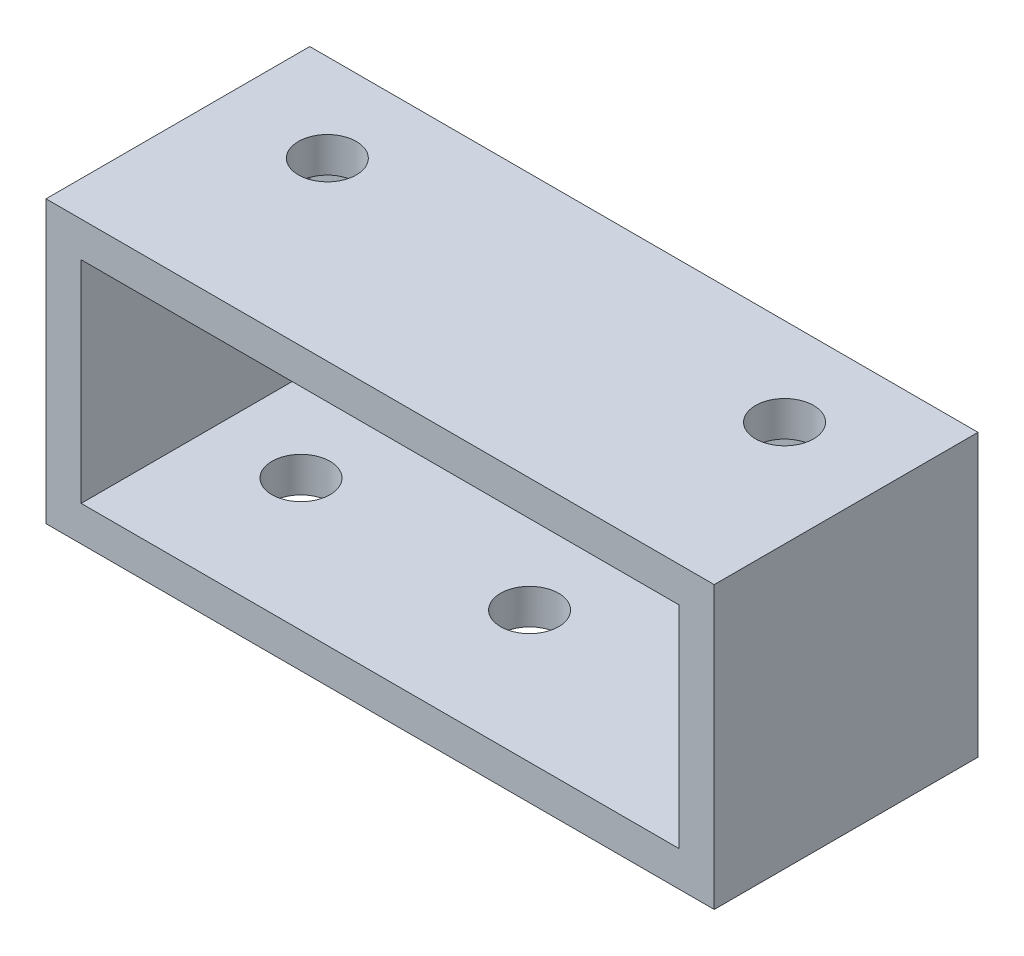
ISO-10303-21;
HEADER;
FILE_DESCRIPTION(('STEP AP214'),'2;1');
FILE_NAME('part.step','',(''),(''),'','','');
FILE_SCHEMA(('AUTOMOTIVE_DESIGN { 1 0 10303 214 1 1 1 1 }'));
ENDSEC;
DATA;
#1=APPLICATION_CONTEXT('core data for automotive mechanical design processes');
#2=APPLICATION_PROTOCOL_DEFINITION('international standard','automotive_design',2000,#1);
#3=PRODUCT_CONTEXT('',#1,'mechanical');
#4=PRODUCT('Part','Part','',(#3));
#5=PRODUCT_RELATED_PRODUCT_CATEGORY('part','',(#4));
#6=PRODUCT_DEFINITION_FORMATION('','',#4);
#7=PRODUCT_DEFINITION_CONTEXT('part definition',#1,'design');
#8=PRODUCT_DEFINITION('design','',#6,#7);
#9=PRODUCT_DEFINITION_SHAPE('','',#8);
#10=(LENGTH_UNIT() NAMED_UNIT(*) SI_UNIT(.MILLI.,.METRE.));
#11=(NAMED_UNIT(*) PLANE_ANGLE_UNIT() SI_UNIT($,.RADIAN.));
#12=(NAMED_UNIT(*) SI_UNIT($,.STERADIAN.) SOLID_ANGLE_UNIT());
#13=UNCERTAINTY_MEASURE_WITH_UNIT(LENGTH_MEASURE(1.E-05),#10,'distance_accuracy_value','');
#14=(GEOMETRIC_REPRESENTATION_CONTEXT(3) GLOBAL_UNCERTAINTY_ASSIGNED_CONTEXT((#13)) GLOBAL_UNIT_ASSIGNED_CONTEXT((#10,
#11,#12)) REPRESENTATION_CONTEXT('',''));
#15=CARTESIAN_POINT('',(0.,0.,0.));
#16=DIRECTION('',(0.,0.,1.));
#17=DIRECTION('',(1.,0.,0.));
#18=AXIS2_PLACEMENT_3D('',#15,#16,#17);
#19=CARTESIAN_POINT('',(0.,16.,0.));
#20=DIRECTION('',(1.,0.,0.));
#21=DIRECTION('',(0.,0.,-1.));
#22=AXIS2_PLACEMENT_3D('',#19,#20,#21);
#23=PLANE('',#22);
#24=DIRECTION('',(0.,0.,1.));
#25=VECTOR('',#24,1.);
#26=CARTESIAN_POINT('',(0.,0.,0.));
#27=LINE('',#26,#25);
#28=CARTESIAN_POINT('',(0.,0.,-15.));
#29=VERTEX_POINT('',#28);
#30=CARTESIAN_POINT('',(0.,0.,0.));
#31=VERTEX_POINT('',#30);
#32=EDGE_CURVE('E145',#29,#31,#27,.T.);
#33=ORIENTED_EDGE('',*,*,#32,.T.);
#34=DIRECTION('',(0.,-1.,0.));
#35=VECTOR('',#34,1.);
#36=CARTESIAN_POINT('',(0.,16.,0.));
#37=LINE('',#36,#35);
#38=CARTESIAN_POINT('',(0.,16.,0.));
#39=VERTEX_POINT('',#38);
#40=EDGE_CURVE('E12',#39,#31,#37,.T.);
#41=ORIENTED_EDGE('',*,*,#40,.F.);
#42=DIRECTION('',(0.,0.,1.));
#43=VECTOR('',#42,1.);
#44=CARTESIAN_POINT('',(0.,16.,0.));
#45=LINE('',#44,#43);
#46=CARTESIAN_POINT('',(0.,16.,-15.));
#47=VERTEX_POINT('',#46);
#48=EDGE_CURVE('E147',#47,#39,#45,.T.);
#49=ORIENTED_EDGE('',*,*,#48,.F.);
#50=DIRECTION('',(0.,-1.,0.));
#51=VECTOR('',#50,1.);
#52=CARTESIAN_POINT('',(0.,16.,-15.));
#53=LINE('',#52,#51);
#54=EDGE_CURVE('E153',#47,#29,#53,.T.);
#55=ORIENTED_EDGE('',*,*,#54,.T.);
#56=EDGE_LOOP('',(#33,#41,#49,#55));
#57=FACE_BOUND('',#56,.T.);
#58=ADVANCED_FACE('F39',(#57),#23,.F.);
#59=CARTESIAN_POINT('',(0.,16.,0.));
#60=DIRECTION('',(0.,0.,-1.));
#61=DIRECTION('',(-1.,0.,0.));
#62=AXIS2_PLACEMENT_3D('',#59,#60,#61);
#63=PLANE('',#62);
#64=DIRECTION('',(1.,0.,0.));
#65=VECTOR('',#64,1.);
#66=CARTESIAN_POINT('',(2.,2.,0.));
#67=LINE('',#66,#65);
#68=CARTESIAN_POINT('',(2.,2.,0.));
#69=VERTEX_POINT('',#68);
#70=CARTESIAN_POINT('',(36.,2.,0.));
#71=VERTEX_POINT('',#70);
#72=EDGE_CURVE('E128',#69,#71,#67,.T.);
#73=ORIENTED_EDGE('',*,*,#72,.F.);
#74=DIRECTION('',(0.,-1.,0.));
#75=VECTOR('',#74,1.);
#76=CARTESIAN_POINT('',(2.,14.,0.));
#77=LINE('',#76,#75);
#78=CARTESIAN_POINT('',(2.,14.,0.));
#79=VERTEX_POINT('',#78);
#80=EDGE_CURVE('E53',#79,#69,#77,.T.);
#81=ORIENTED_EDGE('',*,*,#80,.F.);
#82=DIRECTION('',(-1.,0.,0.));
#83=VECTOR('',#82,1.);
#84=CARTESIAN_POINT('',(36.,14.,0.));
#85=LINE('',#84,#83);
#86=CARTESIAN_POINT('',(36.,14.,0.));
#87=VERTEX_POINT('',#86);
#88=EDGE_CURVE('E134',#87,#79,#85,.T.);
#89=ORIENTED_EDGE('',*,*,#88,.F.);
#90=DIRECTION('',(0.,1.,0.));
#91=VECTOR('',#90,1.);
#92=CARTESIAN_POINT('',(36.,2.,0.));
#93=LINE('',#92,#91);
#94=EDGE_CURVE('E118',#71,#87,#93,.T.);
#95=ORIENTED_EDGE('',*,*,#94,.F.);
#96=EDGE_LOOP('',(#73,#81,#89,#95));
#97=FACE_BOUND('',#96,.T.);
#98=DIRECTION('',(1.,0.,0.));
#99=VECTOR('',#98,1.);
#100=CARTESIAN_POINT('',(0.,0.,0.));
#101=LINE('',#100,#99);
#102=CARTESIAN_POINT('',(38.,0.,0.));
#103=VERTEX_POINT('',#102);
#104=EDGE_CURVE('E156',#31,#103,#101,.T.);
#105=ORIENTED_EDGE('',*,*,#104,.T.);
#106=DIRECTION('',(0.,-1.,0.));
#107=VECTOR('',#106,1.);
#108=CARTESIAN_POINT('',(38.,16.,0.));
#109=LINE('',#108,#107);
#110=CARTESIAN_POINT('',(38.,16.,0.));
#111=VERTEX_POINT('',#110);
#112=EDGE_CURVE('E46',#111,#103,#109,.T.);
#113=ORIENTED_EDGE('',*,*,#112,.F.);
#114=DIRECTION('',(1.,0.,0.));
#115=VECTOR('',#114,1.);
#116=CARTESIAN_POINT('',(0.,16.,0.));
#117=LINE('',#116,#115);
#118=EDGE_CURVE('E90',#39,#111,#117,.T.);
#119=ORIENTED_EDGE('',*,*,#118,.F.);
#120=ORIENTED_EDGE('',*,*,#40,.T.);
#121=EDGE_LOOP('',(#105,#113,#119,#120));
#122=FACE_BOUND('',#121,.T.);
#123=ADVANCED_FACE('F132',(#97,#122),#63,.F.);
#124=CARTESIAN_POINT('',(38.,16.,0.));
#125=DIRECTION('',(-1.,0.,0.));
#126=DIRECTION('',(0.,0.,1.));
#127=AXIS2_PLACEMENT_3D('',#124,#125,#126);
#128=PLANE('',#127);
#129=DIRECTION('',(0.,0.,-1.));
#130=VECTOR('',#129,1.);
#131=CARTESIAN_POINT('',(38.,0.,0.));
#132=LINE('',#131,#130);
#133=CARTESIAN_POINT('',(38.,0.,-15.));
#134=VERTEX_POINT('',#133);
#135=EDGE_CURVE('E158',#103,#134,#132,.T.);
#136=ORIENTED_EDGE('',*,*,#135,.T.);
#137=DIRECTION('',(0.,-1.,0.));
#138=VECTOR('',#137,1.);
#139=CARTESIAN_POINT('',(38.,16.,-15.));
#140=LINE('',#139,#138);
#141=CARTESIAN_POINT('',(38.,16.,-15.));
#142=VERTEX_POINT('',#141);
#143=EDGE_CURVE('E162',#142,#134,#140,.T.);
#144=ORIENTED_EDGE('',*,*,#143,.F.);
#145=DIRECTION('',(0.,0.,-1.));
#146=VECTOR('',#145,1.);
#147=CARTESIAN_POINT('',(38.,16.,0.));
#148=LINE('',#147,#146);
#149=EDGE_CURVE('E150',#111,#142,#148,.T.);
#150=ORIENTED_EDGE('',*,*,#149,.F.);
#151=ORIENTED_EDGE('',*,*,#112,.T.);
#152=EDGE_LOOP('',(#136,#144,#150,#151));
#153=FACE_BOUND('',#152,.T.);
#154=ADVANCED_FACE('F167',(#153),#128,.F.);
#155=CARTESIAN_POINT('',(0.,16.,-15.));
#156=DIRECTION('',(0.,0.,1.));
#157=DIRECTION('',(1.,0.,0.));
#158=AXIS2_PLACEMENT_3D('',#155,#156,#157);
#159=PLANE('',#158);
#160=DIRECTION('',(-1.,0.,0.));
#161=VECTOR('',#160,1.);
#162=CARTESIAN_POINT('',(0.,0.,-15.));
#163=LINE('',#162,#161);
#164=EDGE_CURVE('E83',#134,#29,#163,.T.);
#165=ORIENTED_EDGE('',*,*,#164,.T.);
#166=ORIENTED_EDGE('',*,*,#54,.F.);
#167=DIRECTION('',(-1.,0.,0.));
#168=VECTOR('',#167,1.);
#169=CARTESIAN_POINT('',(0.,16.,-15.));
#170=LINE('',#169,#168);
#171=EDGE_CURVE('E62',#142,#47,#170,.T.);
#172=ORIENTED_EDGE('',*,*,#171,.F.);
#173=ORIENTED_EDGE('',*,*,#143,.T.);
#174=EDGE_LOOP('',(#165,#166,#172,#173));
#175=FACE_BOUND('',#174,.T.);
#176=ADVANCED_FACE('F175',(#175),#159,.F.);
#177=CARTESIAN_POINT('',(0.,16.,0.));
#178=DIRECTION('',(0.,-1.,0.));
#179=DIRECTION('',(0.,0.,-1.));
#180=AXIS2_PLACEMENT_3D('',#177,#178,#179);
#181=PLANE('',#180);
#182=CARTESIAN_POINT('',(6.,16.,-9.99999999999999));
#183=DIRECTION('',(0.,1.,0.));
#184=DIRECTION('',(0.,0.,1.));
#185=AXIS2_PLACEMENT_3D('',#182,#183,#184);
#186=CIRCLE('',#185,1.65);
#187=CARTESIAN_POINT('',(6.,16.,-8.34999999999999));
#188=VERTEX_POINT('',#187);
#189=EDGE_CURVE('E321',#188,#188,#186,.T.);
#190=ORIENTED_EDGE('',*,*,#189,.F.);
#191=EDGE_LOOP('',(#190));
#192=FACE_BOUND('',#191,.T.);
#193=CARTESIAN_POINT('',(32.,16.,-10.));
#194=DIRECTION('',(0.,1.,0.));
#195=DIRECTION('',(0.,0.,-1.));
#196=AXIS2_PLACEMENT_3D('',#193,#194,#195);
#197=CIRCLE('',#196,1.65);
#198=CARTESIAN_POINT('',(32.,16.,-11.65));
#199=VERTEX_POINT('',#198);
#200=EDGE_CURVE('E317',#199,#199,#197,.T.);
#201=ORIENTED_EDGE('',*,*,#200,.F.);
#202=EDGE_LOOP('',(#201));
#203=FACE_BOUND('',#202,.T.);
#204=ORIENTED_EDGE('',*,*,#48,.T.);
#205=ORIENTED_EDGE('',*,*,#118,.T.);
#206=ORIENTED_EDGE('',*,*,#149,.T.);
#207=ORIENTED_EDGE('',*,*,#171,.T.);
#208=EDGE_LOOP('',(#204,#205,#206,#207));
#209=FACE_BOUND('',#208,.T.);
#210=ADVANCED_FACE('F177',(#192,#203,#209),#181,.F.);
#211=CARTESIAN_POINT('',(0.,0.,0.));
#212=DIRECTION('',(0.,-1.,0.));
#213=DIRECTION('',(0.,0.,-1.));
#214=AXIS2_PLACEMENT_3D('',#211,#212,#213);
#215=PLANE('',#214);
#216=CARTESIAN_POINT('',(7.,0.,-7.5));
#217=DIRECTION('',(0.,-1.,0.));
#218=DIRECTION('',(0.,0.,-1.));
#219=AXIS2_PLACEMENT_3D('',#216,#217,#218);
#220=CIRCLE('',#219,1.65);
#221=CARTESIAN_POINT('',(7.,0.,-9.15));
#222=VERTEX_POINT('',#221);
#223=EDGE_CURVE('E304',#222,#222,#220,.T.);
#224=ORIENTED_EDGE('',*,*,#223,.F.);
#225=EDGE_LOOP('',(#224));
#226=FACE_BOUND('',#225,.T.);
#227=CARTESIAN_POINT('',(20.,0.,-7.5));
#228=DIRECTION('',(0.,-1.,0.));
#229=DIRECTION('',(0.,0.,-1.));
#230=AXIS2_PLACEMENT_3D('',#227,#228,#229);
#231=CIRCLE('',#230,1.65);
#232=CARTESIAN_POINT('',(20.,0.,-9.15));
#233=VERTEX_POINT('',#232);
#234=EDGE_CURVE('E308',#233,#233,#231,.T.);
#235=ORIENTED_EDGE('',*,*,#234,.F.);
#236=EDGE_LOOP('',(#235));
#237=FACE_BOUND('',#236,.T.);
#238=ORIENTED_EDGE('',*,*,#32,.F.);
#239=ORIENTED_EDGE('',*,*,#164,.F.);
#240=ORIENTED_EDGE('',*,*,#135,.F.);
#241=ORIENTED_EDGE('',*,*,#104,.F.);
#242=EDGE_LOOP('',(#238,#239,#240,#241));
#243=FACE_BOUND('',#242,.T.);
#244=ADVANCED_FACE('F171',(#226,#237,#243),#215,.T.);
#245=CARTESIAN_POINT('',(2.,14.,-51.0555127546399));
#246=DIRECTION('',(-1.,0.,0.));
#247=DIRECTION('',(0.,0.,1.));
#248=AXIS2_PLACEMENT_3D('',#245,#246,#247);
#249=PLANE('',#248);
#250=DIRECTION('',(0.,1.,0.));
#251=VECTOR('',#250,1.);
#252=CARTESIAN_POINT('',(2.,14.,-13.));
#253=LINE('',#252,#251);
#254=CARTESIAN_POINT('',(2.,2.,-13.));
#255=VERTEX_POINT('',#254);
#256=CARTESIAN_POINT('',(2.,14.,-13.));
#257=VERTEX_POINT('',#256);
#258=EDGE_CURVE('E146',#255,#257,#253,.T.);
#259=ORIENTED_EDGE('',*,*,#258,.T.);
#260=DIRECTION('',(0.,0.,1.));
#261=VECTOR('',#260,1.);
#262=CARTESIAN_POINT('',(2.,14.,-51.0555127546399));
#263=LINE('',#262,#261);
#264=EDGE_CURVE('E139',#257,#79,#263,.T.);
#265=ORIENTED_EDGE('',*,*,#264,.T.);
#266=ORIENTED_EDGE('',*,*,#80,.T.);
#267=DIRECTION('',(0.,0.,1.));
#268=VECTOR('',#267,1.);
#269=CARTESIAN_POINT('',(2.,2.,-51.0555127546399));
#270=LINE('',#269,#268);
#271=EDGE_CURVE('E125',#255,#69,#270,.T.);
#272=ORIENTED_EDGE('',*,*,#271,.F.);
#273=EDGE_LOOP('',(#259,#265,#266,#272));
#274=FACE_BOUND('',#273,.T.);
#275=ADVANCED_FACE('F221',(#274),#249,.F.);
#276=CARTESIAN_POINT('',(36.,14.,-51.0555127546399));
#277=DIRECTION('',(0.,1.,0.));
#278=DIRECTION('',(0.,0.,1.));
#279=AXIS2_PLACEMENT_3D('',#276,#277,#278);
#280=PLANE('',#279);
#281=CARTESIAN_POINT('',(6.,14.,-9.99999999999999));
#282=DIRECTION('',(0.,1.,0.));
#283=DIRECTION('',(0.,0.,1.));
#284=AXIS2_PLACEMENT_3D('',#281,#282,#283);
#285=CIRCLE('',#284,1.65);
#286=CARTESIAN_POINT('',(6.,14.,-8.34999999999999));
#287=VERTEX_POINT('',#286);
#288=EDGE_CURVE('E318',#287,#287,#285,.T.);
#289=ORIENTED_EDGE('',*,*,#288,.T.);
#290=EDGE_LOOP('',(#289));
#291=FACE_BOUND('',#290,.T.);
#292=CARTESIAN_POINT('',(32.,14.,-10.));
#293=DIRECTION('',(0.,1.,0.));
#294=DIRECTION('',(0.,0.,-1.));
#295=AXIS2_PLACEMENT_3D('',#292,#293,#294);
#296=CIRCLE('',#295,1.65);
#297=CARTESIAN_POINT('',(32.,14.,-11.65));
#298=VERTEX_POINT('',#297);
#299=EDGE_CURVE('E324',#298,#298,#296,.T.);
#300=ORIENTED_EDGE('',*,*,#299,.T.);
#301=EDGE_LOOP('',(#300));
#302=FACE_BOUND('',#301,.T.);
#303=DIRECTION('',(1.,0.,0.));
#304=VECTOR('',#303,1.);
#305=CARTESIAN_POINT('',(36.,14.,-13.));
#306=LINE('',#305,#304);
#307=CARTESIAN_POINT('',(36.,14.,-13.));
#308=VERTEX_POINT('',#307);
#309=EDGE_CURVE('E330',#257,#308,#306,.T.);
#310=ORIENTED_EDGE('',*,*,#309,.T.);
#311=DIRECTION('',(0.,0.,1.));
#312=VECTOR('',#311,1.);
#313=CARTESIAN_POINT('',(36.,14.,-51.0555127546399));
#314=LINE('',#313,#312);
#315=EDGE_CURVE('E124',#308,#87,#314,.T.);
#316=ORIENTED_EDGE('',*,*,#315,.T.);
#317=ORIENTED_EDGE('',*,*,#88,.T.);
#318=ORIENTED_EDGE('',*,*,#264,.F.);
#319=EDGE_LOOP('',(#310,#316,#317,#318));
#320=FACE_BOUND('',#319,.T.);
#321=ADVANCED_FACE('F228',(#291,#302,#320),#280,.F.);
#322=CARTESIAN_POINT('',(36.,2.,-51.0555127546399));
#323=DIRECTION('',(1.,0.,0.));
#324=DIRECTION('',(0.,0.,-1.));
#325=AXIS2_PLACEMENT_3D('',#322,#323,#324);
#326=PLANE('',#325);
#327=DIRECTION('',(0.,-1.,0.));
#328=VECTOR('',#327,1.);
#329=CARTESIAN_POINT('',(36.,2.,-13.));
#330=LINE('',#329,#328);
#331=CARTESIAN_POINT('',(36.,2.,-13.));
#332=VERTEX_POINT('',#331);
#333=EDGE_CURVE('E121',#308,#332,#330,.T.);
#334=ORIENTED_EDGE('',*,*,#333,.T.);
#335=DIRECTION('',(0.,0.,1.));
#336=VECTOR('',#335,1.);
#337=CARTESIAN_POINT('',(36.,2.,-51.0555127546399));
#338=LINE('',#337,#336);
#339=EDGE_CURVE('E113',#332,#71,#338,.T.);
#340=ORIENTED_EDGE('',*,*,#339,.T.);
#341=ORIENTED_EDGE('',*,*,#94,.T.);
#342=ORIENTED_EDGE('',*,*,#315,.F.);
#343=EDGE_LOOP('',(#334,#340,#341,#342));
#344=FACE_BOUND('',#343,.T.);
#345=ADVANCED_FACE('F115',(#344),#326,.F.);
#346=CARTESIAN_POINT('',(2.,2.,-51.0555127546399));
#347=DIRECTION('',(0.,-1.,0.));
#348=DIRECTION('',(0.,0.,-1.));
#349=AXIS2_PLACEMENT_3D('',#346,#347,#348);
#350=PLANE('',#349);
#351=CARTESIAN_POINT('',(7.,2.,-7.5));
#352=DIRECTION('',(0.,1.,0.));
#353=DIRECTION('',(0.,0.,1.));
#354=AXIS2_PLACEMENT_3D('',#351,#352,#353);
#355=CIRCLE('',#354,1.65);
#356=CARTESIAN_POINT('',(7.,2.,-5.85));
#357=VERTEX_POINT('',#356);
#358=EDGE_CURVE('E307',#357,#357,#355,.T.);
#359=ORIENTED_EDGE('',*,*,#358,.F.);
#360=EDGE_LOOP('',(#359));
#361=FACE_BOUND('',#360,.T.);
#362=CARTESIAN_POINT('',(20.,2.,-7.5));
#363=DIRECTION('',(0.,1.,0.));
#364=DIRECTION('',(0.,0.,1.));
#365=AXIS2_PLACEMENT_3D('',#362,#363,#364);
#366=CIRCLE('',#365,1.65);
#367=CARTESIAN_POINT('',(20.,2.,-5.85));
#368=VERTEX_POINT('',#367);
#369=EDGE_CURVE('E309',#368,#368,#366,.T.);
#370=ORIENTED_EDGE('',*,*,#369,.F.);
#371=EDGE_LOOP('',(#370));
#372=FACE_BOUND('',#371,.T.);
#373=DIRECTION('',(-1.,0.,0.));
#374=VECTOR('',#373,1.);
#375=CARTESIAN_POINT('',(2.,2.,-13.));
#376=LINE('',#375,#374);
#377=EDGE_CURVE('E143',#332,#255,#376,.T.);
#378=ORIENTED_EDGE('',*,*,#377,.T.);
#379=ORIENTED_EDGE('',*,*,#271,.T.);
#380=ORIENTED_EDGE('',*,*,#72,.T.);
#381=ORIENTED_EDGE('',*,*,#339,.F.);
#382=EDGE_LOOP('',(#378,#379,#380,#381));
#383=FACE_BOUND('',#382,.T.);
#384=ADVANCED_FACE('F129',(#361,#372,#383),#350,.F.);
#385=CARTESIAN_POINT('',(0.,16.,-13.));
#386=DIRECTION('',(0.,0.,1.));
#387=DIRECTION('',(1.,0.,0.));
#388=AXIS2_PLACEMENT_3D('',#385,#386,#387);
#389=PLANE('',#388);
#390=ORIENTED_EDGE('',*,*,#258,.F.);
#391=ORIENTED_EDGE('',*,*,#377,.F.);
#392=ORIENTED_EDGE('',*,*,#333,.F.);
#393=ORIENTED_EDGE('',*,*,#309,.F.);
#394=EDGE_LOOP('',(#390,#391,#392,#393));
#395=FACE_BOUND('',#394,.T.);
#396=ADVANCED_FACE('F251',(#395),#389,.T.);
#397=CARTESIAN_POINT('',(32.,14.,-10.));
#398=DIRECTION('',(0.,1.,0.));
#399=DIRECTION('',(0.,0.,1.));
#400=AXIS2_PLACEMENT_3D('',#397,#398,#399);
#401=CYLINDRICAL_SURFACE('',#400,1.65);
#402=ORIENTED_EDGE('',*,*,#299,.F.);
#403=EDGE_LOOP('',(#402));
#404=FACE_BOUND('',#403,.T.);
#405=ORIENTED_EDGE('',*,*,#200,.T.);
#406=EDGE_LOOP('',(#405));
#407=FACE_BOUND('',#406,.T.);
#408=ADVANCED_FACE('F259',(#404,#407),#401,.F.);
#409=CARTESIAN_POINT('',(6.,14.,-9.99999999999999));
#410=DIRECTION('',(0.,1.,0.));
#411=DIRECTION('',(0.,0.,1.));
#412=AXIS2_PLACEMENT_3D('',#409,#410,#411);
#413=CYLINDRICAL_SURFACE('',#412,1.65);
#414=ORIENTED_EDGE('',*,*,#288,.F.);
#415=EDGE_LOOP('',(#414));
#416=FACE_BOUND('',#415,.T.);
#417=ORIENTED_EDGE('',*,*,#189,.T.);
#418=EDGE_LOOP('',(#417));
#419=FACE_BOUND('',#418,.T.);
#420=ADVANCED_FACE('F267',(#416,#419),#413,.F.);
#421=CARTESIAN_POINT('',(20.,-8.,-7.5));
#422=DIRECTION('',(0.,1.,0.));
#423=DIRECTION('',(0.,0.,1.));
#424=AXIS2_PLACEMENT_3D('',#421,#422,#423);
#425=CYLINDRICAL_SURFACE('',#424,1.65);
#426=ORIENTED_EDGE('',*,*,#234,.T.);
#427=EDGE_LOOP('',(#426));
#428=FACE_BOUND('',#427,.T.);
#429=ORIENTED_EDGE('',*,*,#369,.T.);
#430=EDGE_LOOP('',(#429));
#431=FACE_BOUND('',#430,.T.);
#432=ADVANCED_FACE('F276',(#428,#431),#425,.F.);
#433=CARTESIAN_POINT('',(7.,-8.,-7.5));
#434=DIRECTION('',(0.,1.,0.));
#435=DIRECTION('',(0.,0.,1.));
#436=AXIS2_PLACEMENT_3D('',#433,#434,#435);
#437=CYLINDRICAL_SURFACE('',#436,1.65);
#438=ORIENTED_EDGE('',*,*,#223,.T.);
#439=EDGE_LOOP('',(#438));
#440=FACE_BOUND('',#439,.T.);
#441=ORIENTED_EDGE('',*,*,#358,.T.);
#442=EDGE_LOOP('',(#441));
#443=FACE_BOUND('',#442,.T.);
#444=ADVANCED_FACE('F285',(#440,#443),#437,.F.);
#445=CLOSED_SHELL('',(#58,#123,#154,#176,#210,#244,#275,#321,#345,#384,#396,#408,#420,#432,#444));
#446=MANIFOLD_SOLID_BREP('B2',#445);
#447=ADVANCED_BREP_SHAPE_REPRESENTATION('',(#18,#446),#14);
#448=SHAPE_DEFINITION_REPRESENTATION(#9,#447);
ENDSEC;
END-ISO-10303-21;
